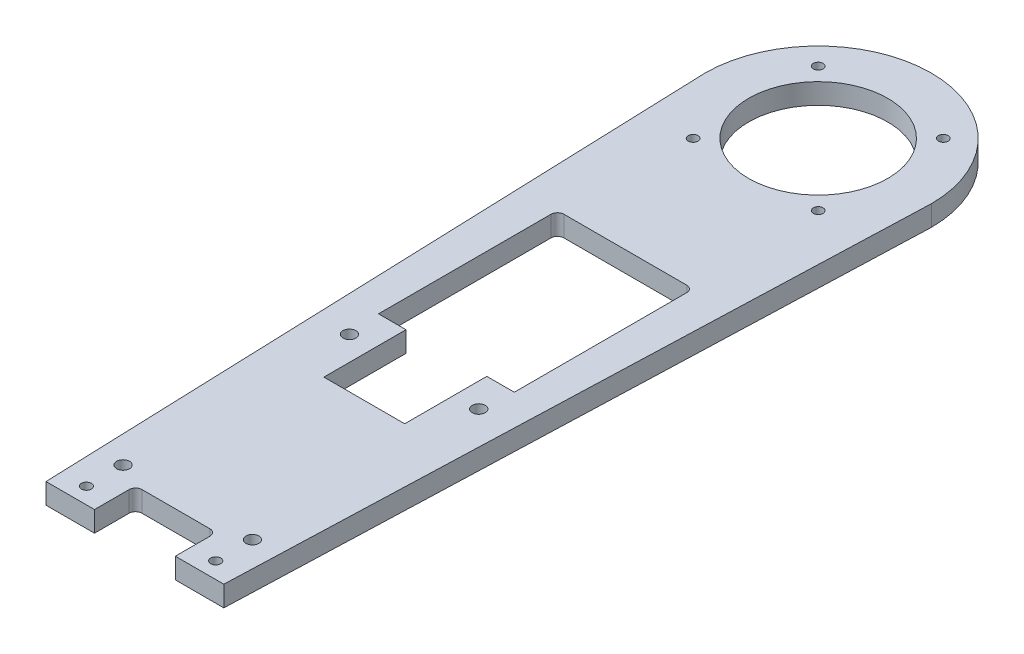
ISO-10303-21;
HEADER;
FILE_DESCRIPTION(('STEP AP214'),'2;1');
FILE_NAME('part.step','',(''),(''),'','','');
FILE_SCHEMA(('AUTOMOTIVE_DESIGN { 1 0 10303 214 1 1 1 1 }'));
ENDSEC;
DATA;
#1=APPLICATION_CONTEXT('core data for automotive mechanical design processes');
#2=APPLICATION_PROTOCOL_DEFINITION('international standard','automotive_design',2000,#1);
#3=PRODUCT_CONTEXT('',#1,'mechanical');
#4=PRODUCT('Part','Part','',(#3));
#5=PRODUCT_RELATED_PRODUCT_CATEGORY('part','',(#4));
#6=PRODUCT_DEFINITION_FORMATION('','',#4);
#7=PRODUCT_DEFINITION_CONTEXT('part definition',#1,'design');
#8=PRODUCT_DEFINITION('design','',#6,#7);
#9=PRODUCT_DEFINITION_SHAPE('','',#8);
#10=(LENGTH_UNIT() NAMED_UNIT(*) SI_UNIT(.MILLI.,.METRE.));
#11=(NAMED_UNIT(*) PLANE_ANGLE_UNIT() SI_UNIT($,.RADIAN.));
#12=(NAMED_UNIT(*) SI_UNIT($,.STERADIAN.) SOLID_ANGLE_UNIT());
#13=UNCERTAINTY_MEASURE_WITH_UNIT(LENGTH_MEASURE(1.E-05),#10,'distance_accuracy_value','');
#14=(GEOMETRIC_REPRESENTATION_CONTEXT(3) GLOBAL_UNCERTAINTY_ASSIGNED_CONTEXT((#13)) GLOBAL_UNIT_ASSIGNED_CONTEXT((#10,
#11,#12)) REPRESENTATION_CONTEXT('',''));
#15=CARTESIAN_POINT('',(0.,0.,0.));
#16=DIRECTION('',(0.,0.,1.));
#17=DIRECTION('',(1.,0.,0.));
#18=AXIS2_PLACEMENT_3D('',#15,#16,#17);
#19=CARTESIAN_POINT('',(12.5,-3.175,0.));
#20=DIRECTION('',(1.,0.,0.));
#21=DIRECTION('',(0.,0.,-1.));
#22=AXIS2_PLACEMENT_3D('',#19,#20,#21);
#23=PLANE('',#22);
#24=DIRECTION('',(0.,0.,-1.));
#25=VECTOR('',#24,1.);
#26=CARTESIAN_POINT('',(12.5,-3.175,0.));
#27=LINE('',#26,#25);
#28=CARTESIAN_POINT('',(12.5,-3.175,140.4));
#29=VERTEX_POINT('',#28);
#30=CARTESIAN_POINT('',(12.5,-3.175,115.));
#31=VERTEX_POINT('',#30);
#32=EDGE_CURVE('E188',#29,#31,#27,.T.);
#33=ORIENTED_EDGE('',*,*,#32,.F.);
#34=DIRECTION('',(0.,1.,0.));
#35=VECTOR('',#34,1.);
#36=CARTESIAN_POINT('',(12.5,-66.563188962929,140.4));
#37=LINE('',#36,#35);
#38=CARTESIAN_POINT('',(12.5,3.175,140.4));
#39=VERTEX_POINT('',#38);
#40=EDGE_CURVE('E175',#29,#39,#37,.T.);
#41=ORIENTED_EDGE('',*,*,#40,.T.);
#42=DIRECTION('',(0.,0.,-1.));
#43=VECTOR('',#42,1.);
#44=CARTESIAN_POINT('',(12.5,3.175,0.));
#45=LINE('',#44,#43);
#46=CARTESIAN_POINT('',(12.5,3.175,115.));
#47=VERTEX_POINT('',#46);
#48=EDGE_CURVE('E186',#39,#47,#45,.T.);
#49=ORIENTED_EDGE('',*,*,#48,.T.);
#50=DIRECTION('',(0.,1.,0.));
#51=VECTOR('',#50,1.);
#52=CARTESIAN_POINT('',(12.5,-3.175,115.));
#53=LINE('',#52,#51);
#54=EDGE_CURVE('E214',#31,#47,#53,.T.);
#55=ORIENTED_EDGE('',*,*,#54,.F.);
#56=EDGE_LOOP('',(#33,#41,#49,#55));
#57=FACE_BOUND('',#56,.T.);
#58=ADVANCED_FACE('F35',(#57),#23,.F.);
#59=CARTESIAN_POINT('',(-12.5,-3.175,0.));
#60=DIRECTION('',(1.,0.,0.));
#61=DIRECTION('',(0.,0.,-1.));
#62=AXIS2_PLACEMENT_3D('',#59,#60,#61);
#63=PLANE('',#62);
#64=DIRECTION('',(0.,1.,0.));
#65=VECTOR('',#64,1.);
#66=CARTESIAN_POINT('',(-12.5,-66.563188962929,140.4));
#67=LINE('',#66,#65);
#68=CARTESIAN_POINT('',(-12.5,-3.175,140.4));
#69=VERTEX_POINT('',#68);
#70=CARTESIAN_POINT('',(-12.5,3.175,140.4));
#71=VERTEX_POINT('',#70);
#72=EDGE_CURVE('E178',#69,#71,#67,.T.);
#73=ORIENTED_EDGE('',*,*,#72,.F.);
#74=DIRECTION('',(0.,0.,-1.));
#75=VECTOR('',#74,1.);
#76=CARTESIAN_POINT('',(-12.5,-3.175,0.));
#77=LINE('',#76,#75);
#78=CARTESIAN_POINT('',(-12.5,-3.175,115.));
#79=VERTEX_POINT('',#78);
#80=EDGE_CURVE('E312',#69,#79,#77,.T.);
#81=ORIENTED_EDGE('',*,*,#80,.T.);
#82=DIRECTION('',(0.,1.,0.));
#83=VECTOR('',#82,1.);
#84=CARTESIAN_POINT('',(-12.5,-3.175,115.));
#85=LINE('',#84,#83);
#86=CARTESIAN_POINT('',(-12.5,3.175,115.));
#87=VERTEX_POINT('',#86);
#88=EDGE_CURVE('E221',#79,#87,#85,.T.);
#89=ORIENTED_EDGE('',*,*,#88,.T.);
#90=DIRECTION('',(0.,0.,-1.));
#91=VECTOR('',#90,1.);
#92=CARTESIAN_POINT('',(-12.5,3.175,0.));
#93=LINE('',#92,#91);
#94=EDGE_CURVE('E200',#71,#87,#93,.T.);
#95=ORIENTED_EDGE('',*,*,#94,.F.);
#96=EDGE_LOOP('',(#73,#81,#89,#95));
#97=FACE_BOUND('',#96,.T.);
#98=ADVANCED_FACE('F405',(#97),#63,.T.);
#99=CARTESIAN_POINT('',(0.,3.175,211.35));
#100=DIRECTION('',(0.,0.,-1.));
#101=DIRECTION('',(-1.,0.,0.));
#102=AXIS2_PLACEMENT_3D('',#99,#100,#101);
#103=PLANE('',#102);
#104=DIRECTION('',(0.,1.,0.));
#105=VECTOR('',#104,1.);
#106=CARTESIAN_POINT('',(-12.5,-3.175,211.35));
#107=LINE('',#106,#105);
#108=CARTESIAN_POINT('',(-12.5,-3.175,211.35));
#109=VERTEX_POINT('',#108);
#110=CARTESIAN_POINT('',(-12.5,3.175,211.35));
#111=VERTEX_POINT('',#110);
#112=EDGE_CURVE('E218',#109,#111,#107,.T.);
#113=ORIENTED_EDGE('',*,*,#112,.T.);
#114=DIRECTION('',(1.,0.,0.));
#115=VECTOR('',#114,1.);
#116=CARTESIAN_POINT('',(0.,3.175,211.35));
#117=LINE('',#116,#115);
#118=CARTESIAN_POINT('',(-27.5,3.175,211.35));
#119=VERTEX_POINT('',#118);
#120=EDGE_CURVE('E242',#119,#111,#117,.T.);
#121=ORIENTED_EDGE('',*,*,#120,.F.);
#122=DIRECTION('',(0.,-1.,0.));
#123=VECTOR('',#122,1.);
#124=CARTESIAN_POINT('',(-27.5,3.175,211.35));
#125=LINE('',#124,#123);
#126=CARTESIAN_POINT('',(-27.5,-3.175,211.35));
#127=VERTEX_POINT('',#126);
#128=EDGE_CURVE('E257',#119,#127,#125,.T.);
#129=ORIENTED_EDGE('',*,*,#128,.T.);
#130=DIRECTION('',(1.,0.,0.));
#131=VECTOR('',#130,1.);
#132=CARTESIAN_POINT('',(0.,-3.175,211.35));
#133=LINE('',#132,#131);
#134=EDGE_CURVE('E237',#127,#109,#133,.T.);
#135=ORIENTED_EDGE('',*,*,#134,.T.);
#136=EDGE_LOOP('',(#113,#121,#129,#135));
#137=FACE_BOUND('',#136,.T.);
#138=ADVANCED_FACE('F451',(#137),#103,.F.);
#139=CARTESIAN_POINT('',(34.9559810663247,3.175,1.24045355096965));
#140=DIRECTION('',(-0.999370960244846,0.,-0.0354638381917972));
#141=DIRECTION('',(-0.0354638381917973,0.,0.999370960244846));
#142=AXIS2_PLACEMENT_3D('',#139,#140,#141);
#143=PLANE('',#142);
#144=DIRECTION('',(0.0354638381917973,0.,-0.999370960244846));
#145=VECTOR('',#144,1.);
#146=CARTESIAN_POINT('',(34.9559810663247,-3.175,1.24045355096965));
#147=LINE('',#146,#145);
#148=CARTESIAN_POINT('',(27.5,-3.175,211.35));
#149=VERTEX_POINT('',#148);
#150=CARTESIAN_POINT('',(35.,-3.175,0.));
#151=VERTEX_POINT('',#150);
#152=EDGE_CURVE('E230',#149,#151,#147,.T.);
#153=ORIENTED_EDGE('',*,*,#152,.T.);
#154=DIRECTION('',(0.,-1.,0.));
#155=VECTOR('',#154,1.);
#156=CARTESIAN_POINT('',(35.,3.175,0.));
#157=LINE('',#156,#155);
#158=CARTESIAN_POINT('',(35.,3.175,0.));
#159=VERTEX_POINT('',#158);
#160=EDGE_CURVE('E263',#159,#151,#157,.T.);
#161=ORIENTED_EDGE('',*,*,#160,.F.);
#162=DIRECTION('',(0.0354638381917973,0.,-0.999370960244846));
#163=VECTOR('',#162,1.);
#164=CARTESIAN_POINT('',(34.9559810663247,3.175,1.24045355096965));
#165=LINE('',#164,#163);
#166=CARTESIAN_POINT('',(27.5,3.175,211.35));
#167=VERTEX_POINT('',#166);
#168=EDGE_CURVE('E233',#167,#159,#165,.T.);
#169=ORIENTED_EDGE('',*,*,#168,.F.);
#170=DIRECTION('',(0.,-1.,0.));
#171=VECTOR('',#170,1.);
#172=CARTESIAN_POINT('',(27.5,3.175,211.35));
#173=LINE('',#172,#171);
#174=EDGE_CURVE('E245',#167,#149,#173,.T.);
#175=ORIENTED_EDGE('',*,*,#174,.T.);
#176=EDGE_LOOP('',(#153,#161,#169,#175));
#177=FACE_BOUND('',#176,.T.);
#178=ADVANCED_FACE('F476',(#177),#143,.F.);
#179=CARTESIAN_POINT('',(0.,3.175,0.));
#180=DIRECTION('',(0.,-1.,0.));
#181=DIRECTION('',(0.,0.,-1.));
#182=AXIS2_PLACEMENT_3D('',#179,#180,#181);
#183=CYLINDRICAL_SURFACE('',#182,35.);
#184=CARTESIAN_POINT('',(0.,-3.175,0.));
#185=DIRECTION('',(0.,1.,0.));
#186=DIRECTION('',(0.,0.,1.));
#187=AXIS2_PLACEMENT_3D('',#184,#185,#186);
#188=CIRCLE('',#187,35.);
#189=CARTESIAN_POINT('',(-35.,-3.175,0.));
#190=VERTEX_POINT('',#189);
#191=EDGE_CURVE('E248',#151,#190,#188,.T.);
#192=ORIENTED_EDGE('',*,*,#191,.T.);
#193=DIRECTION('',(0.,-1.,0.));
#194=VECTOR('',#193,1.);
#195=CARTESIAN_POINT('',(-35.,3.175,0.));
#196=LINE('',#195,#194);
#197=CARTESIAN_POINT('',(-35.,3.175,0.));
#198=VERTEX_POINT('',#197);
#199=EDGE_CURVE('E260',#198,#190,#196,.T.);
#200=ORIENTED_EDGE('',*,*,#199,.F.);
#201=CARTESIAN_POINT('',(0.,3.175,0.));
#202=DIRECTION('',(0.,1.,0.));
#203=DIRECTION('',(0.,0.,1.));
#204=AXIS2_PLACEMENT_3D('',#201,#202,#203);
#205=CIRCLE('',#204,35.);
#206=EDGE_CURVE('E236',#159,#198,#205,.T.);
#207=ORIENTED_EDGE('',*,*,#206,.F.);
#208=ORIENTED_EDGE('',*,*,#160,.T.);
#209=EDGE_LOOP('',(#192,#200,#207,#208));
#210=FACE_BOUND('',#209,.T.);
#211=ADVANCED_FACE('F472',(#210),#183,.T.);
#212=CARTESIAN_POINT('',(-34.9559810663247,3.175,1.24045355096965));
#213=DIRECTION('',(0.999370960244846,0.,-0.0354638381917972));
#214=DIRECTION('',(-0.0354638381917973,0.,-0.999370960244846));
#215=AXIS2_PLACEMENT_3D('',#212,#213,#214);
#216=PLANE('',#215);
#217=DIRECTION('',(0.0354638381917973,0.,0.999370960244846));
#218=VECTOR('',#217,1.);
#219=CARTESIAN_POINT('',(-34.9559810663247,-3.175,1.24045355096965));
#220=LINE('',#219,#218);
#221=EDGE_CURVE('E250',#190,#127,#220,.T.);
#222=ORIENTED_EDGE('',*,*,#221,.T.);
#223=ORIENTED_EDGE('',*,*,#128,.F.);
#224=DIRECTION('',(0.0354638381917973,0.,0.999370960244846));
#225=VECTOR('',#224,1.);
#226=CARTESIAN_POINT('',(-34.9559810663247,3.175,1.24045355096965));
#227=LINE('',#226,#225);
#228=EDGE_CURVE('E239',#198,#119,#227,.T.);
#229=ORIENTED_EDGE('',*,*,#228,.F.);
#230=ORIENTED_EDGE('',*,*,#199,.T.);
#231=EDGE_LOOP('',(#222,#223,#229,#230));
#232=FACE_BOUND('',#231,.T.);
#233=ADVANCED_FACE('F468',(#232),#216,.F.);
#234=CARTESIAN_POINT('',(12.5,3.175,211.35));
#235=VERTEX_POINT('',#234);
#236=EDGE_CURVE('E241',#235,#167,#117,.T.);
#237=ORIENTED_EDGE('',*,*,#236,.F.);
#238=DIRECTION('',(0.,1.,0.));
#239=VECTOR('',#238,1.);
#240=CARTESIAN_POINT('',(12.5,-3.175,211.35));
#241=LINE('',#240,#239);
#242=CARTESIAN_POINT('',(12.5,-3.175,211.35));
#243=VERTEX_POINT('',#242);
#244=EDGE_CURVE('E216',#243,#235,#241,.T.);
#245=ORIENTED_EDGE('',*,*,#244,.F.);
#246=EDGE_CURVE('E252',#243,#149,#133,.T.);
#247=ORIENTED_EDGE('',*,*,#246,.T.);
#248=ORIENTED_EDGE('',*,*,#174,.F.);
#249=EDGE_LOOP('',(#237,#245,#247,#248));
#250=FACE_BOUND('',#249,.T.);
#251=ADVANCED_FACE('F463',(#250),#103,.F.);
#252=CARTESIAN_POINT('',(0.,3.175,0.));
#253=DIRECTION('',(0.,1.,0.));
#254=DIRECTION('',(0.,0.,1.));
#255=AXIS2_PLACEMENT_3D('',#252,#253,#254);
#256=PLANE('',#255);
#257=ORIENTED_EDGE('',*,*,#48,.F.);
#258=DIRECTION('',(-1.,0.,0.));
#259=VECTOR('',#258,1.);
#260=CARTESIAN_POINT('',(-12.5,3.175,140.4));
#261=LINE('',#260,#259);
#262=EDGE_CURVE('E171',#39,#71,#261,.T.);
#263=ORIENTED_EDGE('',*,*,#262,.T.);
#264=ORIENTED_EDGE('',*,*,#94,.T.);
#265=DIRECTION('',(-1.,0.,0.));
#266=VECTOR('',#265,1.);
#267=CARTESIAN_POINT('',(0.,3.175,115.));
#268=LINE('',#267,#266);
#269=CARTESIAN_POINT('',(-21.,3.175,115.));
#270=VERTEX_POINT('',#269);
#271=EDGE_CURVE('E400',#87,#270,#268,.T.);
#272=ORIENTED_EDGE('',*,*,#271,.T.);
#273=DIRECTION('',(0.,0.,-1.));
#274=VECTOR('',#273,1.);
#275=CARTESIAN_POINT('',(-21.,3.175,0.));
#276=LINE('',#275,#274);
#277=CARTESIAN_POINT('',(-21.,3.175,61.65));
#278=VERTEX_POINT('',#277);
#279=EDGE_CURVE('E384',#270,#278,#276,.T.);
#280=ORIENTED_EDGE('',*,*,#279,.T.);
#281=CARTESIAN_POINT('',(-19.,3.175,61.65));
#282=DIRECTION('',(0.,1.,0.));
#283=DIRECTION('',(0.,0.,1.));
#284=AXIS2_PLACEMENT_3D('',#281,#282,#283);
#285=CIRCLE('',#284,2.);
#286=CARTESIAN_POINT('',(-19.,3.175,59.65));
#287=VERTEX_POINT('',#286);
#288=EDGE_CURVE('E289',#278,#287,#285,.F.);
#289=ORIENTED_EDGE('',*,*,#288,.T.);
#290=DIRECTION('',(-1.,0.,0.));
#291=VECTOR('',#290,1.);
#292=CARTESIAN_POINT('',(0.,3.175,59.65));
#293=LINE('',#292,#291);
#294=CARTESIAN_POINT('',(19.,3.175,59.65));
#295=VERTEX_POINT('',#294);
#296=EDGE_CURVE('E207',#295,#287,#293,.T.);
#297=ORIENTED_EDGE('',*,*,#296,.F.);
#298=CARTESIAN_POINT('',(19.,3.175,61.65));
#299=DIRECTION('',(0.,1.,0.));
#300=DIRECTION('',(0.,0.,1.));
#301=AXIS2_PLACEMENT_3D('',#298,#299,#300);
#302=CIRCLE('',#301,2.);
#303=CARTESIAN_POINT('',(21.,3.175,61.65));
#304=VERTEX_POINT('',#303);
#305=EDGE_CURVE('E285',#295,#304,#302,.F.);
#306=ORIENTED_EDGE('',*,*,#305,.T.);
#307=DIRECTION('',(0.,0.,-1.));
#308=VECTOR('',#307,1.);
#309=CARTESIAN_POINT('',(21.,3.175,0.));
#310=LINE('',#309,#308);
#311=CARTESIAN_POINT('',(21.,3.175,115.));
#312=VERTEX_POINT('',#311);
#313=EDGE_CURVE('E204',#312,#304,#310,.T.);
#314=ORIENTED_EDGE('',*,*,#313,.F.);
#315=EDGE_CURVE('E195',#312,#47,#268,.T.);
#316=ORIENTED_EDGE('',*,*,#315,.T.);
#317=EDGE_LOOP('',(#257,#263,#264,#272,#280,#289,#297,#306,#314,#316));
#318=FACE_BOUND('',#317,.T.);
#319=CARTESIAN_POINT('',(-20.,3.175,206.35));
#320=DIRECTION('',(0.,-1.,0.));
#321=DIRECTION('',(0.,0.,-1.));
#322=AXIS2_PLACEMENT_3D('',#319,#320,#321);
#323=CIRCLE('',#322,1.55);
#324=CARTESIAN_POINT('',(-20.,3.175,204.8));
#325=VERTEX_POINT('',#324);
#326=EDGE_CURVE('E327',#325,#325,#323,.T.);
#327=ORIENTED_EDGE('',*,*,#326,.T.);
#328=EDGE_LOOP('',(#327));
#329=FACE_BOUND('',#328,.T.);
#330=CARTESIAN_POINT('',(20.,3.175,206.35));
#331=DIRECTION('',(0.,-1.,0.));
#332=DIRECTION('',(0.,0.,-1.));
#333=AXIS2_PLACEMENT_3D('',#330,#331,#332);
#334=CIRCLE('',#333,1.55);
#335=CARTESIAN_POINT('',(20.,3.175,204.8));
#336=VERTEX_POINT('',#335);
#337=EDGE_CURVE('E334',#336,#336,#334,.T.);
#338=ORIENTED_EDGE('',*,*,#337,.T.);
#339=EDGE_LOOP('',(#338));
#340=FACE_BOUND('',#339,.T.);
#341=CARTESIAN_POINT('',(-20.,3.175,125.));
#342=DIRECTION('',(0.,1.,0.));
#343=DIRECTION('',(0.,0.,-1.));
#344=AXIS2_PLACEMENT_3D('',#341,#342,#343);
#345=CIRCLE('',#344,2.00000000000001);
#346=CARTESIAN_POINT('',(-20.,3.175,123.));
#347=VERTEX_POINT('',#346);
#348=EDGE_CURVE('E330',#347,#347,#345,.T.);
#349=ORIENTED_EDGE('',*,*,#348,.F.);
#350=EDGE_LOOP('',(#349));
#351=FACE_BOUND('',#350,.T.);
#352=CARTESIAN_POINT('',(20.,3.175,125.));
#353=DIRECTION('',(0.,1.,0.));
#354=DIRECTION('',(0.,0.,-1.));
#355=AXIS2_PLACEMENT_3D('',#352,#353,#354);
#356=CIRCLE('',#355,2.00000000000001);
#357=CARTESIAN_POINT('',(20.,3.175,123.));
#358=VERTEX_POINT('',#357);
#359=EDGE_CURVE('E349',#358,#358,#356,.T.);
#360=ORIENTED_EDGE('',*,*,#359,.F.);
#361=EDGE_LOOP('',(#360));
#362=FACE_BOUND('',#361,.T.);
#363=CARTESIAN_POINT('',(20.,3.175,195.));
#364=DIRECTION('',(0.,1.,0.));
#365=DIRECTION('',(0.,0.,1.));
#366=AXIS2_PLACEMENT_3D('',#363,#364,#365);
#367=CIRCLE('',#366,2.00000000000001);
#368=CARTESIAN_POINT('',(20.,3.175,197.));
#369=VERTEX_POINT('',#368);
#370=EDGE_CURVE('E343',#369,#369,#367,.T.);
#371=ORIENTED_EDGE('',*,*,#370,.F.);
#372=EDGE_LOOP('',(#371));
#373=FACE_BOUND('',#372,.T.);
#374=CARTESIAN_POINT('',(-20.,3.175,195.));
#375=DIRECTION('',(0.,1.,0.));
#376=DIRECTION('',(0.,0.,1.));
#377=AXIS2_PLACEMENT_3D('',#374,#375,#376);
#378=CIRCLE('',#377,2.00000000000001);
#379=CARTESIAN_POINT('',(-20.,3.175,197.));
#380=VERTEX_POINT('',#379);
#381=EDGE_CURVE('E342',#380,#380,#378,.T.);
#382=ORIENTED_EDGE('',*,*,#381,.F.);
#383=EDGE_LOOP('',(#382));
#384=FACE_BOUND('',#383,.T.);
#385=CARTESIAN_POINT('',(-19.35,3.175,19.35));
#386=DIRECTION('',(0.,1.,0.));
#387=DIRECTION('',(0.,0.,1.));
#388=AXIS2_PLACEMENT_3D('',#385,#386,#387);
#389=CIRCLE('',#388,1.5);
#390=CARTESIAN_POINT('',(-19.35,3.175,20.85));
#391=VERTEX_POINT('',#390);
#392=EDGE_CURVE('E360',#391,#391,#389,.T.);
#393=ORIENTED_EDGE('',*,*,#392,.F.);
#394=EDGE_LOOP('',(#393));
#395=FACE_BOUND('',#394,.T.);
#396=CARTESIAN_POINT('',(19.35,3.175,19.35));
#397=DIRECTION('',(0.,1.,0.));
#398=DIRECTION('',(0.,0.,1.));
#399=AXIS2_PLACEMENT_3D('',#396,#397,#398);
#400=CIRCLE('',#399,1.5);
#401=CARTESIAN_POINT('',(19.35,3.175,20.85));
#402=VERTEX_POINT('',#401);
#403=EDGE_CURVE('E373',#402,#402,#400,.T.);
#404=ORIENTED_EDGE('',*,*,#403,.F.);
#405=EDGE_LOOP('',(#404));
#406=FACE_BOUND('',#405,.T.);
#407=CARTESIAN_POINT('',(19.35,3.175,-19.35));
#408=DIRECTION('',(0.,1.,0.));
#409=DIRECTION('',(0.,0.,1.));
#410=AXIS2_PLACEMENT_3D('',#407,#408,#409);
#411=CIRCLE('',#410,1.5);
#412=CARTESIAN_POINT('',(19.35,3.175,-17.85));
#413=VERTEX_POINT('',#412);
#414=EDGE_CURVE('E367',#413,#413,#411,.T.);
#415=ORIENTED_EDGE('',*,*,#414,.F.);
#416=EDGE_LOOP('',(#415));
#417=FACE_BOUND('',#416,.T.);
#418=CARTESIAN_POINT('',(-19.35,3.175,-19.35));
#419=DIRECTION('',(0.,1.,0.));
#420=DIRECTION('',(0.,0.,1.));
#421=AXIS2_PLACEMENT_3D('',#418,#419,#420);
#422=CIRCLE('',#421,1.5);
#423=CARTESIAN_POINT('',(-19.35,3.175,-17.85));
#424=VERTEX_POINT('',#423);
#425=EDGE_CURVE('E366',#424,#424,#422,.T.);
#426=ORIENTED_EDGE('',*,*,#425,.F.);
#427=EDGE_LOOP('',(#426));
#428=FACE_BOUND('',#427,.T.);
#429=CARTESIAN_POINT('',(12.5,3.175,200.65));
#430=VERTEX_POINT('',#429);
#431=EDGE_CURVE('E196',#235,#430,#45,.T.);
#432=ORIENTED_EDGE('',*,*,#431,.F.);
#433=ORIENTED_EDGE('',*,*,#236,.T.);
#434=ORIENTED_EDGE('',*,*,#168,.T.);
#435=ORIENTED_EDGE('',*,*,#206,.T.);
#436=ORIENTED_EDGE('',*,*,#228,.T.);
#437=ORIENTED_EDGE('',*,*,#120,.T.);
#438=CARTESIAN_POINT('',(-12.5,3.175,200.65));
#439=VERTEX_POINT('',#438);
#440=EDGE_CURVE('E197',#111,#439,#93,.T.);
#441=ORIENTED_EDGE('',*,*,#440,.T.);
#442=CARTESIAN_POINT('',(-10.5,3.175,200.65));
#443=DIRECTION('',(0.,1.,0.));
#444=DIRECTION('',(0.,0.,1.));
#445=AXIS2_PLACEMENT_3D('',#442,#443,#444);
#446=CIRCLE('',#445,2.);
#447=CARTESIAN_POINT('',(-10.5,3.175,198.65));
#448=VERTEX_POINT('',#447);
#449=EDGE_CURVE('E293',#439,#448,#446,.F.);
#450=ORIENTED_EDGE('',*,*,#449,.T.);
#451=DIRECTION('',(1.,0.,0.));
#452=VECTOR('',#451,1.);
#453=CARTESIAN_POINT('',(-12.5,3.175,198.65));
#454=LINE('',#453,#452);
#455=CARTESIAN_POINT('',(10.5,3.175,198.65));
#456=VERTEX_POINT('',#455);
#457=EDGE_CURVE('E181',#448,#456,#454,.T.);
#458=ORIENTED_EDGE('',*,*,#457,.T.);
#459=CARTESIAN_POINT('',(10.5,3.175,200.65));
#460=DIRECTION('',(0.,1.,0.));
#461=DIRECTION('',(0.,0.,1.));
#462=AXIS2_PLACEMENT_3D('',#459,#460,#461);
#463=CIRCLE('',#462,2.);
#464=EDGE_CURVE('E43',#456,#430,#463,.F.);
#465=ORIENTED_EDGE('',*,*,#464,.T.);
#466=EDGE_LOOP('',(#432,#433,#434,#435,#436,#437,#441,#450,#458,#465));
#467=FACE_BOUND('',#466,.T.);
#468=CARTESIAN_POINT('',(0.,3.175,0.));
#469=DIRECTION('',(0.,1.,0.));
#470=DIRECTION('',(0.,0.,1.));
#471=AXIS2_PLACEMENT_3D('',#468,#469,#470);
#472=CIRCLE('',#471,21.5);
#473=CARTESIAN_POINT('',(0.,3.175,21.5));
#474=VERTEX_POINT('',#473);
#475=EDGE_CURVE('E213',#474,#474,#472,.T.);
#476=ORIENTED_EDGE('',*,*,#475,.F.);
#477=EDGE_LOOP('',(#476));
#478=FACE_BOUND('',#477,.T.);
#479=ADVANCED_FACE('F191',(#318,#329,#340,#351,#362,#373,#384,#395,#406,#417,#428,#467,#478),
#256,.T.);
#480=CARTESIAN_POINT('',(0.,-3.175,0.));
#481=DIRECTION('',(0.,1.,0.));
#482=DIRECTION('',(0.,0.,1.));
#483=AXIS2_PLACEMENT_3D('',#480,#481,#482);
#484=PLANE('',#483);
#485=CARTESIAN_POINT('',(12.5,-3.175,200.65));
#486=VERTEX_POINT('',#485);
#487=EDGE_CURVE('E392',#243,#486,#27,.T.);
#488=ORIENTED_EDGE('',*,*,#487,.T.);
#489=CARTESIAN_POINT('',(10.5,-3.175,200.65));
#490=DIRECTION('',(0.,1.,0.));
#491=DIRECTION('',(0.,0.,1.));
#492=AXIS2_PLACEMENT_3D('',#489,#490,#491);
#493=CIRCLE('',#492,2.);
#494=CARTESIAN_POINT('',(10.5,-3.175,198.65));
#495=VERTEX_POINT('',#494);
#496=EDGE_CURVE('E11',#486,#495,#493,.T.);
#497=ORIENTED_EDGE('',*,*,#496,.T.);
#498=DIRECTION('',(-1.,0.,0.));
#499=VECTOR('',#498,1.);
#500=CARTESIAN_POINT('',(-12.5,-3.175,198.65));
#501=LINE('',#500,#499);
#502=CARTESIAN_POINT('',(-10.5,-3.175,198.65));
#503=VERTEX_POINT('',#502);
#504=EDGE_CURVE('E306',#495,#503,#501,.T.);
#505=ORIENTED_EDGE('',*,*,#504,.T.);
#506=CARTESIAN_POINT('',(-10.5,-3.175,200.65));
#507=DIRECTION('',(0.,1.,0.));
#508=DIRECTION('',(0.,0.,1.));
#509=AXIS2_PLACEMENT_3D('',#506,#507,#508);
#510=CIRCLE('',#509,2.);
#511=CARTESIAN_POINT('',(-12.5,-3.175,200.65));
#512=VERTEX_POINT('',#511);
#513=EDGE_CURVE('E295',#503,#512,#510,.T.);
#514=ORIENTED_EDGE('',*,*,#513,.T.);
#515=EDGE_CURVE('E304',#109,#512,#77,.T.);
#516=ORIENTED_EDGE('',*,*,#515,.F.);
#517=ORIENTED_EDGE('',*,*,#134,.F.);
#518=ORIENTED_EDGE('',*,*,#221,.F.);
#519=ORIENTED_EDGE('',*,*,#191,.F.);
#520=ORIENTED_EDGE('',*,*,#152,.F.);
#521=ORIENTED_EDGE('',*,*,#246,.F.);
#522=EDGE_LOOP('',(#488,#497,#505,#514,#516,#517,#518,#519,#520,#521));
#523=FACE_BOUND('',#522,.T.);
#524=CARTESIAN_POINT('',(-20.,-3.175,206.35));
#525=DIRECTION('',(0.,-1.,0.));
#526=DIRECTION('',(0.,0.,-1.));
#527=AXIS2_PLACEMENT_3D('',#524,#525,#526);
#528=CIRCLE('',#527,1.55);
#529=CARTESIAN_POINT('',(-20.,-3.175,204.8));
#530=VERTEX_POINT('',#529);
#531=EDGE_CURVE('E331',#530,#530,#528,.T.);
#532=ORIENTED_EDGE('',*,*,#531,.F.);
#533=EDGE_LOOP('',(#532));
#534=FACE_BOUND('',#533,.T.);
#535=CARTESIAN_POINT('',(20.,-3.175,206.35));
#536=DIRECTION('',(0.,-1.,0.));
#537=DIRECTION('',(0.,0.,-1.));
#538=AXIS2_PLACEMENT_3D('',#535,#536,#537);
#539=CIRCLE('',#538,1.55);
#540=CARTESIAN_POINT('',(20.,-3.175,204.8));
#541=VERTEX_POINT('',#540);
#542=EDGE_CURVE('E326',#541,#541,#539,.T.);
#543=ORIENTED_EDGE('',*,*,#542,.F.);
#544=EDGE_LOOP('',(#543));
#545=FACE_BOUND('',#544,.T.);
#546=CARTESIAN_POINT('',(-20.,-3.175,125.));
#547=DIRECTION('',(0.,1.,0.));
#548=DIRECTION('',(0.,0.,-1.));
#549=AXIS2_PLACEMENT_3D('',#546,#547,#548);
#550=CIRCLE('',#549,2.00000000000001);
#551=CARTESIAN_POINT('',(-20.,-3.175,123.));
#552=VERTEX_POINT('',#551);
#553=EDGE_CURVE('E352',#552,#552,#550,.T.);
#554=ORIENTED_EDGE('',*,*,#553,.T.);
#555=EDGE_LOOP('',(#554));
#556=FACE_BOUND('',#555,.T.);
#557=CARTESIAN_POINT('',(20.,-3.175,125.));
#558=DIRECTION('',(0.,1.,0.));
#559=DIRECTION('',(0.,0.,-1.));
#560=AXIS2_PLACEMENT_3D('',#557,#558,#559);
#561=CIRCLE('',#560,2.00000000000001);
#562=CARTESIAN_POINT('',(20.,-3.175,123.));
#563=VERTEX_POINT('',#562);
#564=EDGE_CURVE('E346',#563,#563,#561,.T.);
#565=ORIENTED_EDGE('',*,*,#564,.T.);
#566=EDGE_LOOP('',(#565));
#567=FACE_BOUND('',#566,.T.);
#568=CARTESIAN_POINT('',(20.,-3.175,195.));
#569=DIRECTION('',(0.,1.,0.));
#570=DIRECTION('',(0.,0.,1.));
#571=AXIS2_PLACEMENT_3D('',#568,#569,#570);
#572=CIRCLE('',#571,2.00000000000001);
#573=CARTESIAN_POINT('',(20.,-3.175,197.));
#574=VERTEX_POINT('',#573);
#575=EDGE_CURVE('E339',#574,#574,#572,.T.);
#576=ORIENTED_EDGE('',*,*,#575,.T.);
#577=EDGE_LOOP('',(#576));
#578=FACE_BOUND('',#577,.T.);
#579=CARTESIAN_POINT('',(-20.,-3.175,195.));
#580=DIRECTION('',(0.,1.,0.));
#581=DIRECTION('',(0.,0.,1.));
#582=AXIS2_PLACEMENT_3D('',#579,#580,#581);
#583=CIRCLE('',#582,2.00000000000001);
#584=CARTESIAN_POINT('',(-20.,-3.175,197.));
#585=VERTEX_POINT('',#584);
#586=EDGE_CURVE('E357',#585,#585,#583,.T.);
#587=ORIENTED_EDGE('',*,*,#586,.T.);
#588=EDGE_LOOP('',(#587));
#589=FACE_BOUND('',#588,.T.);
#590=CARTESIAN_POINT('',(-19.35,-3.175,19.35));
#591=DIRECTION('',(0.,1.,0.));
#592=DIRECTION('',(0.,0.,1.));
#593=AXIS2_PLACEMENT_3D('',#590,#591,#592);
#594=CIRCLE('',#593,1.5);
#595=CARTESIAN_POINT('',(-19.35,-3.175,20.85));
#596=VERTEX_POINT('',#595);
#597=EDGE_CURVE('E376',#596,#596,#594,.T.);
#598=ORIENTED_EDGE('',*,*,#597,.T.);
#599=EDGE_LOOP('',(#598));
#600=FACE_BOUND('',#599,.T.);
#601=CARTESIAN_POINT('',(19.35,-3.175,19.35));
#602=DIRECTION('',(0.,1.,0.));
#603=DIRECTION('',(0.,0.,1.));
#604=AXIS2_PLACEMENT_3D('',#601,#602,#603);
#605=CIRCLE('',#604,1.5);
#606=CARTESIAN_POINT('',(19.35,-3.175,20.85));
#607=VERTEX_POINT('',#606);
#608=EDGE_CURVE('E370',#607,#607,#605,.T.);
#609=ORIENTED_EDGE('',*,*,#608,.T.);
#610=EDGE_LOOP('',(#609));
#611=FACE_BOUND('',#610,.T.);
#612=CARTESIAN_POINT('',(19.35,-3.175,-19.35));
#613=DIRECTION('',(0.,1.,0.));
#614=DIRECTION('',(0.,0.,1.));
#615=AXIS2_PLACEMENT_3D('',#612,#613,#614);
#616=CIRCLE('',#615,1.5);
#617=CARTESIAN_POINT('',(19.35,-3.175,-17.85));
#618=VERTEX_POINT('',#617);
#619=EDGE_CURVE('E363',#618,#618,#616,.T.);
#620=ORIENTED_EDGE('',*,*,#619,.T.);
#621=EDGE_LOOP('',(#620));
#622=FACE_BOUND('',#621,.T.);
#623=CARTESIAN_POINT('',(-19.35,-3.175,-19.35));
#624=DIRECTION('',(0.,1.,0.));
#625=DIRECTION('',(0.,0.,1.));
#626=AXIS2_PLACEMENT_3D('',#623,#624,#625);
#627=CIRCLE('',#626,1.5);
#628=CARTESIAN_POINT('',(-19.35,-3.175,-17.85));
#629=VERTEX_POINT('',#628);
#630=EDGE_CURVE('E381',#629,#629,#627,.T.);
#631=ORIENTED_EDGE('',*,*,#630,.T.);
#632=EDGE_LOOP('',(#631));
#633=FACE_BOUND('',#632,.T.);
#634=CARTESIAN_POINT('',(0.,-3.175,0.));
#635=DIRECTION('',(0.,1.,0.));
#636=DIRECTION('',(0.,0.,1.));
#637=AXIS2_PLACEMENT_3D('',#634,#635,#636);
#638=CIRCLE('',#637,21.5);
#639=CARTESIAN_POINT('',(0.,-3.175,21.5));
#640=VERTEX_POINT('',#639);
#641=EDGE_CURVE('E227',#640,#640,#638,.T.);
#642=ORIENTED_EDGE('',*,*,#641,.T.);
#643=EDGE_LOOP('',(#642));
#644=FACE_BOUND('',#643,.T.);
#645=DIRECTION('',(1.,0.,0.));
#646=VECTOR('',#645,1.);
#647=CARTESIAN_POINT('',(-12.5,-3.175,140.4));
#648=LINE('',#647,#646);
#649=EDGE_CURVE('E322',#69,#29,#648,.T.);
#650=ORIENTED_EDGE('',*,*,#649,.T.);
#651=ORIENTED_EDGE('',*,*,#32,.T.);
#652=DIRECTION('',(-1.,0.,0.));
#653=VECTOR('',#652,1.);
#654=CARTESIAN_POINT('',(0.,-3.175,115.));
#655=LINE('',#654,#653);
#656=CARTESIAN_POINT('',(21.,-3.175,115.));
#657=VERTEX_POINT('',#656);
#658=EDGE_CURVE('E390',#657,#31,#655,.T.);
#659=ORIENTED_EDGE('',*,*,#658,.F.);
#660=DIRECTION('',(0.,0.,-1.));
#661=VECTOR('',#660,1.);
#662=CARTESIAN_POINT('',(21.,-3.175,0.));
#663=LINE('',#662,#661);
#664=CARTESIAN_POINT('',(21.,-3.175,61.65));
#665=VERTEX_POINT('',#664);
#666=EDGE_CURVE('E394',#657,#665,#663,.T.);
#667=ORIENTED_EDGE('',*,*,#666,.T.);
#668=CARTESIAN_POINT('',(19.,-3.175,61.65));
#669=DIRECTION('',(0.,1.,0.));
#670=DIRECTION('',(0.,0.,1.));
#671=AXIS2_PLACEMENT_3D('',#668,#669,#670);
#672=CIRCLE('',#671,2.);
#673=CARTESIAN_POINT('',(19.,-3.175,59.65));
#674=VERTEX_POINT('',#673);
#675=EDGE_CURVE('E287',#665,#674,#672,.T.);
#676=ORIENTED_EDGE('',*,*,#675,.T.);
#677=DIRECTION('',(-1.,0.,0.));
#678=VECTOR('',#677,1.);
#679=CARTESIAN_POINT('',(0.,-3.175,59.65));
#680=LINE('',#679,#678);
#681=CARTESIAN_POINT('',(-19.,-3.175,59.65));
#682=VERTEX_POINT('',#681);
#683=EDGE_CURVE('E226',#674,#682,#680,.T.);
#684=ORIENTED_EDGE('',*,*,#683,.T.);
#685=CARTESIAN_POINT('',(-19.,-3.175,61.65));
#686=DIRECTION('',(0.,1.,0.));
#687=DIRECTION('',(0.,0.,1.));
#688=AXIS2_PLACEMENT_3D('',#685,#686,#687);
#689=CIRCLE('',#688,2.);
#690=CARTESIAN_POINT('',(-21.,-3.175,61.65));
#691=VERTEX_POINT('',#690);
#692=EDGE_CURVE('E291',#682,#691,#689,.T.);
#693=ORIENTED_EDGE('',*,*,#692,.T.);
#694=DIRECTION('',(0.,0.,-1.));
#695=VECTOR('',#694,1.);
#696=CARTESIAN_POINT('',(-21.,-3.175,0.));
#697=LINE('',#696,#695);
#698=CARTESIAN_POINT('',(-21.,-3.175,115.));
#699=VERTEX_POINT('',#698);
#700=EDGE_CURVE('E210',#699,#691,#697,.T.);
#701=ORIENTED_EDGE('',*,*,#700,.F.);
#702=EDGE_CURVE('E389',#79,#699,#655,.T.);
#703=ORIENTED_EDGE('',*,*,#702,.F.);
#704=ORIENTED_EDGE('',*,*,#80,.F.);
#705=EDGE_LOOP('',(#650,#651,#659,#667,#676,#684,#693,#701,#703,#704));
#706=FACE_BOUND('',#705,.T.);
#707=ADVANCED_FACE('F301',(#523,#534,#545,#556,#567,#578,#589,#600,#611,#622,#633,#644,#706),
#484,.F.);
#708=CARTESIAN_POINT('',(0.,-3.175,0.));
#709=DIRECTION('',(0.,1.,0.));
#710=DIRECTION('',(0.,0.,1.));
#711=AXIS2_PLACEMENT_3D('',#708,#709,#710);
#712=CYLINDRICAL_SURFACE('',#711,21.5);
#713=ORIENTED_EDGE('',*,*,#641,.F.);
#714=EDGE_LOOP('',(#713));
#715=FACE_BOUND('',#714,.T.);
#716=ORIENTED_EDGE('',*,*,#475,.T.);
#717=EDGE_LOOP('',(#716));
#718=FACE_BOUND('',#717,.T.);
#719=ADVANCED_FACE('F457',(#715,#718),#712,.F.);
#720=CARTESIAN_POINT('',(-21.,-3.175,0.));
#721=DIRECTION('',(1.,0.,0.));
#722=DIRECTION('',(0.,0.,-1.));
#723=AXIS2_PLACEMENT_3D('',#720,#721,#722);
#724=PLANE('',#723);
#725=ORIENTED_EDGE('',*,*,#700,.T.);
#726=DIRECTION('',(0.,1.,0.));
#727=VECTOR('',#726,1.);
#728=CARTESIAN_POINT('',(-21.,-3.175,61.65));
#729=LINE('',#728,#727);
#730=EDGE_CURVE('E273',#691,#278,#729,.T.);
#731=ORIENTED_EDGE('',*,*,#730,.T.);
#732=ORIENTED_EDGE('',*,*,#279,.F.);
#733=DIRECTION('',(0.,1.,0.));
#734=VECTOR('',#733,1.);
#735=CARTESIAN_POINT('',(-21.,-3.175,115.));
#736=LINE('',#735,#734);
#737=EDGE_CURVE('E224',#699,#270,#736,.T.);
#738=ORIENTED_EDGE('',*,*,#737,.F.);
#739=EDGE_LOOP('',(#725,#731,#732,#738));
#740=FACE_BOUND('',#739,.T.);
#741=ADVANCED_FACE('F413',(#740),#724,.T.);
#742=CARTESIAN_POINT('',(0.,-3.175,59.65));
#743=DIRECTION('',(0.,0.,-1.));
#744=DIRECTION('',(-1.,0.,0.));
#745=AXIS2_PLACEMENT_3D('',#742,#743,#744);
#746=PLANE('',#745);
#747=ORIENTED_EDGE('',*,*,#683,.F.);
#748=DIRECTION('',(0.,1.,0.));
#749=VECTOR('',#748,1.);
#750=CARTESIAN_POINT('',(19.,3.175,59.65));
#751=LINE('',#750,#749);
#752=EDGE_CURVE('E268',#674,#295,#751,.T.);
#753=ORIENTED_EDGE('',*,*,#752,.T.);
#754=ORIENTED_EDGE('',*,*,#296,.T.);
#755=DIRECTION('',(0.,1.,0.));
#756=VECTOR('',#755,1.);
#757=CARTESIAN_POINT('',(-19.,-3.175,59.65));
#758=LINE('',#757,#756);
#759=EDGE_CURVE('E266',#287,#682,#758,.F.);
#760=ORIENTED_EDGE('',*,*,#759,.T.);
#761=EDGE_LOOP('',(#747,#753,#754,#760));
#762=FACE_BOUND('',#761,.T.);
#763=ADVANCED_FACE('F420',(#762),#746,.F.);
#764=CARTESIAN_POINT('',(21.,-3.175,0.));
#765=DIRECTION('',(1.,0.,0.));
#766=DIRECTION('',(0.,0.,-1.));
#767=AXIS2_PLACEMENT_3D('',#764,#765,#766);
#768=PLANE('',#767);
#769=ORIENTED_EDGE('',*,*,#313,.T.);
#770=DIRECTION('',(0.,1.,0.));
#771=VECTOR('',#770,1.);
#772=CARTESIAN_POINT('',(21.,-3.175,61.65));
#773=LINE('',#772,#771);
#774=EDGE_CURVE('E271',#304,#665,#773,.F.);
#775=ORIENTED_EDGE('',*,*,#774,.T.);
#776=ORIENTED_EDGE('',*,*,#666,.F.);
#777=DIRECTION('',(0.,1.,0.));
#778=VECTOR('',#777,1.);
#779=CARTESIAN_POINT('',(21.,-3.175,115.));
#780=LINE('',#779,#778);
#781=EDGE_CURVE('E211',#657,#312,#780,.T.);
#782=ORIENTED_EDGE('',*,*,#781,.T.);
#783=EDGE_LOOP('',(#769,#775,#776,#782));
#784=FACE_BOUND('',#783,.T.);
#785=ADVANCED_FACE('F430',(#784),#768,.F.);
#786=CARTESIAN_POINT('',(0.,-3.175,115.));
#787=DIRECTION('',(0.,0.,-1.));
#788=DIRECTION('',(-1.,0.,0.));
#789=AXIS2_PLACEMENT_3D('',#786,#787,#788);
#790=PLANE('',#789);
#791=ORIENTED_EDGE('',*,*,#315,.F.);
#792=ORIENTED_EDGE('',*,*,#781,.F.);
#793=ORIENTED_EDGE('',*,*,#658,.T.);
#794=ORIENTED_EDGE('',*,*,#54,.T.);
#795=EDGE_LOOP('',(#791,#792,#793,#794));
#796=FACE_BOUND('',#795,.T.);
#797=ADVANCED_FACE('F435',(#796),#790,.T.);
#798=ORIENTED_EDGE('',*,*,#431,.T.);
#799=DIRECTION('',(0.,1.,0.));
#800=VECTOR('',#799,1.);
#801=CARTESIAN_POINT('',(12.5,-3.175,200.65));
#802=LINE('',#801,#800);
#803=EDGE_CURVE('E50',#430,#486,#802,.F.);
#804=ORIENTED_EDGE('',*,*,#803,.T.);
#805=ORIENTED_EDGE('',*,*,#487,.F.);
#806=ORIENTED_EDGE('',*,*,#244,.T.);
#807=EDGE_LOOP('',(#798,#804,#805,#806));
#808=FACE_BOUND('',#807,.T.);
#809=ADVANCED_FACE('F437',(#808),#23,.F.);
#810=ORIENTED_EDGE('',*,*,#515,.T.);
#811=DIRECTION('',(0.,1.,0.));
#812=VECTOR('',#811,1.);
#813=CARTESIAN_POINT('',(-12.5,3.175,200.65));
#814=LINE('',#813,#812);
#815=EDGE_CURVE('E276',#512,#439,#814,.T.);
#816=ORIENTED_EDGE('',*,*,#815,.T.);
#817=ORIENTED_EDGE('',*,*,#440,.F.);
#818=ORIENTED_EDGE('',*,*,#112,.F.);
#819=EDGE_LOOP('',(#810,#816,#817,#818));
#820=FACE_BOUND('',#819,.T.);
#821=ADVANCED_FACE('F311',(#820),#63,.T.);
#822=ORIENTED_EDGE('',*,*,#271,.F.);
#823=ORIENTED_EDGE('',*,*,#88,.F.);
#824=ORIENTED_EDGE('',*,*,#702,.T.);
#825=ORIENTED_EDGE('',*,*,#737,.T.);
#826=EDGE_LOOP('',(#822,#823,#824,#825));
#827=FACE_BOUND('',#826,.T.);
#828=ADVANCED_FACE('F408',(#827),#790,.T.);
#829=CARTESIAN_POINT('',(-19.35,-3.175,-19.35));
#830=DIRECTION('',(0.,1.,0.));
#831=DIRECTION('',(0.,0.,1.));
#832=AXIS2_PLACEMENT_3D('',#829,#830,#831);
#833=CYLINDRICAL_SURFACE('',#832,1.5);
#834=ORIENTED_EDGE('',*,*,#630,.F.);
#835=EDGE_LOOP('',(#834));
#836=FACE_BOUND('',#835,.T.);
#837=ORIENTED_EDGE('',*,*,#425,.T.);
#838=EDGE_LOOP('',(#837));
#839=FACE_BOUND('',#838,.T.);
#840=ADVANCED_FACE('F446',(#836,#839),#833,.F.);
#841=CARTESIAN_POINT('',(19.35,-3.175,-19.35));
#842=DIRECTION('',(0.,1.,0.));
#843=DIRECTION('',(0.,0.,1.));
#844=AXIS2_PLACEMENT_3D('',#841,#842,#843);
#845=CYLINDRICAL_SURFACE('',#844,1.5);
#846=ORIENTED_EDGE('',*,*,#619,.F.);
#847=EDGE_LOOP('',(#846));
#848=FACE_BOUND('',#847,.T.);
#849=ORIENTED_EDGE('',*,*,#414,.T.);
#850=EDGE_LOOP('',(#849));
#851=FACE_BOUND('',#850,.T.);
#852=ADVANCED_FACE('F666',(#848,#851),#845,.F.);
#853=CARTESIAN_POINT('',(19.35,-3.175,19.35));
#854=DIRECTION('',(0.,1.,0.));
#855=DIRECTION('',(0.,0.,1.));
#856=AXIS2_PLACEMENT_3D('',#853,#854,#855);
#857=CYLINDRICAL_SURFACE('',#856,1.5);
#858=ORIENTED_EDGE('',*,*,#608,.F.);
#859=EDGE_LOOP('',(#858));
#860=FACE_BOUND('',#859,.T.);
#861=ORIENTED_EDGE('',*,*,#403,.T.);
#862=EDGE_LOOP('',(#861));
#863=FACE_BOUND('',#862,.T.);
#864=ADVANCED_FACE('F658',(#860,#863),#857,.F.);
#865=CARTESIAN_POINT('',(-19.35,-3.175,19.35));
#866=DIRECTION('',(0.,1.,0.));
#867=DIRECTION('',(0.,0.,1.));
#868=AXIS2_PLACEMENT_3D('',#865,#866,#867);
#869=CYLINDRICAL_SURFACE('',#868,1.5);
#870=ORIENTED_EDGE('',*,*,#597,.F.);
#871=EDGE_LOOP('',(#870));
#872=FACE_BOUND('',#871,.T.);
#873=ORIENTED_EDGE('',*,*,#392,.T.);
#874=EDGE_LOOP('',(#873));
#875=FACE_BOUND('',#874,.T.);
#876=ADVANCED_FACE('F650',(#872,#875),#869,.F.);
#877=CARTESIAN_POINT('',(-20.,-3.175,195.));
#878=DIRECTION('',(0.,1.,0.));
#879=DIRECTION('',(0.,0.,1.));
#880=AXIS2_PLACEMENT_3D('',#877,#878,#879);
#881=CYLINDRICAL_SURFACE('',#880,2.00000000000001);
#882=ORIENTED_EDGE('',*,*,#586,.F.);
#883=EDGE_LOOP('',(#882));
#884=FACE_BOUND('',#883,.T.);
#885=ORIENTED_EDGE('',*,*,#381,.T.);
#886=EDGE_LOOP('',(#885));
#887=FACE_BOUND('',#886,.T.);
#888=ADVANCED_FACE('F642',(#884,#887),#881,.F.);
#889=CARTESIAN_POINT('',(20.,-3.175,195.));
#890=DIRECTION('',(0.,1.,0.));
#891=DIRECTION('',(0.,0.,1.));
#892=AXIS2_PLACEMENT_3D('',#889,#890,#891);
#893=CYLINDRICAL_SURFACE('',#892,2.00000000000001);
#894=ORIENTED_EDGE('',*,*,#575,.F.);
#895=EDGE_LOOP('',(#894));
#896=FACE_BOUND('',#895,.T.);
#897=ORIENTED_EDGE('',*,*,#370,.T.);
#898=EDGE_LOOP('',(#897));
#899=FACE_BOUND('',#898,.T.);
#900=ADVANCED_FACE('F634',(#896,#899),#893,.F.);
#901=CARTESIAN_POINT('',(20.,-3.175,125.));
#902=DIRECTION('',(0.,1.,0.));
#903=DIRECTION('',(0.,0.,1.));
#904=AXIS2_PLACEMENT_3D('',#901,#902,#903);
#905=CYLINDRICAL_SURFACE('',#904,2.00000000000001);
#906=ORIENTED_EDGE('',*,*,#564,.F.);
#907=EDGE_LOOP('',(#906));
#908=FACE_BOUND('',#907,.T.);
#909=ORIENTED_EDGE('',*,*,#359,.T.);
#910=EDGE_LOOP('',(#909));
#911=FACE_BOUND('',#910,.T.);
#912=ADVANCED_FACE('F626',(#908,#911),#905,.F.);
#913=CARTESIAN_POINT('',(-20.,-3.175,125.));
#914=DIRECTION('',(0.,1.,0.));
#915=DIRECTION('',(0.,0.,1.));
#916=AXIS2_PLACEMENT_3D('',#913,#914,#915);
#917=CYLINDRICAL_SURFACE('',#916,2.00000000000001);
#918=ORIENTED_EDGE('',*,*,#553,.F.);
#919=EDGE_LOOP('',(#918));
#920=FACE_BOUND('',#919,.T.);
#921=ORIENTED_EDGE('',*,*,#348,.T.);
#922=EDGE_LOOP('',(#921));
#923=FACE_BOUND('',#922,.T.);
#924=ADVANCED_FACE('F618',(#920,#923),#917,.F.);
#925=CARTESIAN_POINT('',(20.,3.175,206.35));
#926=DIRECTION('',(0.,-1.,0.));
#927=DIRECTION('',(0.,0.,-1.));
#928=AXIS2_PLACEMENT_3D('',#925,#926,#927);
#929=CYLINDRICAL_SURFACE('',#928,1.55);
#930=ORIENTED_EDGE('',*,*,#337,.F.);
#931=EDGE_LOOP('',(#930));
#932=FACE_BOUND('',#931,.T.);
#933=ORIENTED_EDGE('',*,*,#542,.T.);
#934=EDGE_LOOP('',(#933));
#935=FACE_BOUND('',#934,.T.);
#936=ADVANCED_FACE('F610',(#932,#935),#929,.F.);
#937=CARTESIAN_POINT('',(-20.,3.175,206.35));
#938=DIRECTION('',(0.,-1.,0.));
#939=DIRECTION('',(0.,0.,-1.));
#940=AXIS2_PLACEMENT_3D('',#937,#938,#939);
#941=CYLINDRICAL_SURFACE('',#940,1.55);
#942=ORIENTED_EDGE('',*,*,#326,.F.);
#943=EDGE_LOOP('',(#942));
#944=FACE_BOUND('',#943,.T.);
#945=ORIENTED_EDGE('',*,*,#531,.T.);
#946=EDGE_LOOP('',(#945));
#947=FACE_BOUND('',#946,.T.);
#948=ADVANCED_FACE('F604',(#944,#947),#941,.F.);
#949=CARTESIAN_POINT('',(-12.5,-66.563188962929,140.4));
#950=DIRECTION('',(0.,0.,-1.));
#951=DIRECTION('',(-1.,0.,0.));
#952=AXIS2_PLACEMENT_3D('',#949,#950,#951);
#953=PLANE('',#952);
#954=ORIENTED_EDGE('',*,*,#649,.F.);
#955=ORIENTED_EDGE('',*,*,#72,.T.);
#956=ORIENTED_EDGE('',*,*,#262,.F.);
#957=ORIENTED_EDGE('',*,*,#40,.F.);
#958=EDGE_LOOP('',(#954,#955,#956,#957));
#959=FACE_BOUND('',#958,.T.);
#960=ADVANCED_FACE('F174',(#959),#953,.T.);
#961=CARTESIAN_POINT('',(-12.5,-66.563188962929,198.65));
#962=DIRECTION('',(0.,0.,1.));
#963=DIRECTION('',(1.,0.,0.));
#964=AXIS2_PLACEMENT_3D('',#961,#962,#963);
#965=PLANE('',#964);
#966=ORIENTED_EDGE('',*,*,#457,.F.);
#967=DIRECTION('',(0.,1.,0.));
#968=VECTOR('',#967,1.);
#969=CARTESIAN_POINT('',(-10.5,-3.175,198.65));
#970=LINE('',#969,#968);
#971=EDGE_CURVE('E282',#448,#503,#970,.F.);
#972=ORIENTED_EDGE('',*,*,#971,.T.);
#973=ORIENTED_EDGE('',*,*,#504,.F.);
#974=DIRECTION('',(0.,1.,0.));
#975=VECTOR('',#974,1.);
#976=CARTESIAN_POINT('',(10.5,-66.563188962929,198.65));
#977=LINE('',#976,#975);
#978=EDGE_CURVE('E279',#495,#456,#977,.T.);
#979=ORIENTED_EDGE('',*,*,#978,.T.);
#980=EDGE_LOOP('',(#966,#972,#973,#979));
#981=FACE_BOUND('',#980,.T.);
#982=ADVANCED_FACE('F318',(#981),#965,.T.);
#983=CARTESIAN_POINT('',(19.,-3.175,61.65));
#984=DIRECTION('',(0.,-1.,0.));
#985=DIRECTION('',(0.,0.,-1.));
#986=AXIS2_PLACEMENT_3D('',#983,#984,#985);
#987=CYLINDRICAL_SURFACE('',#986,2.);
#988=ORIENTED_EDGE('',*,*,#675,.F.);
#989=ORIENTED_EDGE('',*,*,#774,.F.);
#990=ORIENTED_EDGE('',*,*,#305,.F.);
#991=ORIENTED_EDGE('',*,*,#752,.F.);
#992=EDGE_LOOP('',(#988,#989,#990,#991));
#993=FACE_BOUND('',#992,.T.);
#994=ADVANCED_FACE('F427',(#993),#987,.F.);
#995=CARTESIAN_POINT('',(-19.,-3.175,61.65));
#996=DIRECTION('',(0.,1.,0.));
#997=DIRECTION('',(0.,0.,1.));
#998=AXIS2_PLACEMENT_3D('',#995,#996,#997);
#999=CYLINDRICAL_SURFACE('',#998,2.);
#1000=ORIENTED_EDGE('',*,*,#692,.F.);
#1001=ORIENTED_EDGE('',*,*,#759,.F.);
#1002=ORIENTED_EDGE('',*,*,#288,.F.);
#1003=ORIENTED_EDGE('',*,*,#730,.F.);
#1004=EDGE_LOOP('',(#1000,#1001,#1002,#1003));
#1005=FACE_BOUND('',#1004,.T.);
#1006=ADVANCED_FACE('F423',(#1005),#999,.F.);
#1007=CARTESIAN_POINT('',(-10.5,-3.175,200.65));
#1008=DIRECTION('',(0.,-1.,0.));
#1009=DIRECTION('',(0.,0.,-1.));
#1010=AXIS2_PLACEMENT_3D('',#1007,#1008,#1009);
#1011=CYLINDRICAL_SURFACE('',#1010,2.);
#1012=ORIENTED_EDGE('',*,*,#513,.F.);
#1013=ORIENTED_EDGE('',*,*,#971,.F.);
#1014=ORIENTED_EDGE('',*,*,#449,.F.);
#1015=ORIENTED_EDGE('',*,*,#815,.F.);
#1016=EDGE_LOOP('',(#1012,#1013,#1014,#1015));
#1017=FACE_BOUND('',#1016,.T.);
#1018=ADVANCED_FACE('F314',(#1017),#1011,.F.);
#1019=CARTESIAN_POINT('',(10.5,-66.563188962929,200.65));
#1020=DIRECTION('',(0.,1.,0.));
#1021=DIRECTION('',(0.,0.,1.));
#1022=AXIS2_PLACEMENT_3D('',#1019,#1020,#1021);
#1023=CYLINDRICAL_SURFACE('',#1022,2.);
#1024=ORIENTED_EDGE('',*,*,#496,.F.);
#1025=ORIENTED_EDGE('',*,*,#803,.F.);
#1026=ORIENTED_EDGE('',*,*,#464,.F.);
#1027=ORIENTED_EDGE('',*,*,#978,.F.);
#1028=EDGE_LOOP('',(#1024,#1025,#1026,#1027));
#1029=FACE_BOUND('',#1028,.T.);
#1030=ADVANCED_FACE('F37',(#1029),#1023,.F.);
#1031=CLOSED_SHELL('',(#58,#98,#138,#178,#211,#233,#251,#479,#707,#719,#741,#763,#785,#797,#809,
#821,#828,#840,#852,#864,#876,#888,#900,#912,#924,#936,#948,#960,#982,#994,#1006,#1018,#1030));
#1032=MANIFOLD_SOLID_BREP('B2',#1031);
#1033=ADVANCED_BREP_SHAPE_REPRESENTATION('',(#18,#1032),#14);
#1034=SHAPE_DEFINITION_REPRESENTATION(#9,#1033);
ENDSEC;
END-ISO-10303-21;
